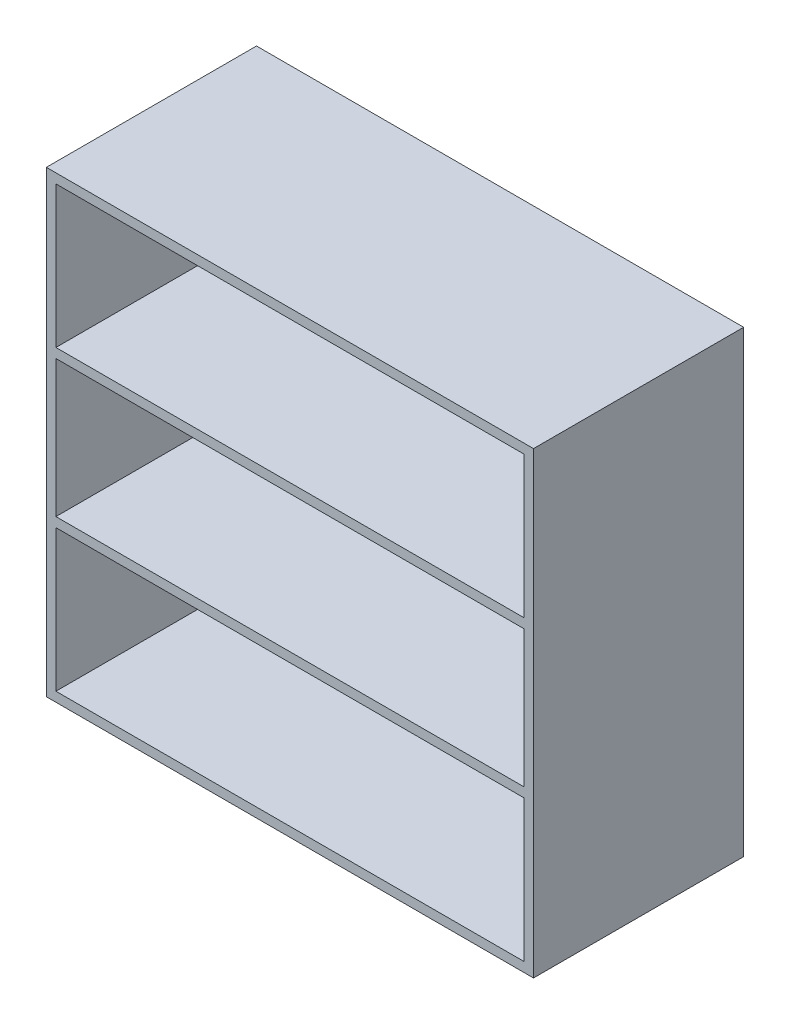
ISO-10303-21;
HEADER;
FILE_DESCRIPTION(('STEP AP214'),'2;1');
FILE_NAME('part.step','',(''),(''),'','','');
FILE_SCHEMA(('AUTOMOTIVE_DESIGN { 1 0 10303 214 1 1 1 1 }'));
ENDSEC;
DATA;
#1=APPLICATION_CONTEXT('core data for automotive mechanical design processes');
#2=APPLICATION_PROTOCOL_DEFINITION('international standard','automotive_design',2000,#1);
#3=PRODUCT_CONTEXT('',#1,'mechanical');
#4=PRODUCT('Part','Part','',(#3));
#5=PRODUCT_RELATED_PRODUCT_CATEGORY('part','',(#4));
#6=PRODUCT_DEFINITION_FORMATION('','',#4);
#7=PRODUCT_DEFINITION_CONTEXT('part definition',#1,'design');
#8=PRODUCT_DEFINITION('design','',#6,#7);
#9=PRODUCT_DEFINITION_SHAPE('','',#8);
#10=(LENGTH_UNIT() NAMED_UNIT(*) SI_UNIT(.MILLI.,.METRE.));
#11=(NAMED_UNIT(*) PLANE_ANGLE_UNIT() SI_UNIT($,.RADIAN.));
#12=(NAMED_UNIT(*) SI_UNIT($,.STERADIAN.) SOLID_ANGLE_UNIT());
#13=UNCERTAINTY_MEASURE_WITH_UNIT(LENGTH_MEASURE(1.E-05),#10,'distance_accuracy_value','');
#14=(GEOMETRIC_REPRESENTATION_CONTEXT(3) GLOBAL_UNCERTAINTY_ASSIGNED_CONTEXT((#13)) GLOBAL_UNIT_ASSIGNED_CONTEXT((#10,
#11,#12)) REPRESENTATION_CONTEXT('',''));
#15=CARTESIAN_POINT('',(0.,0.,0.));
#16=DIRECTION('',(0.,0.,1.));
#17=DIRECTION('',(1.,0.,0.));
#18=AXIS2_PLACEMENT_3D('',#15,#16,#17);
#19=CARTESIAN_POINT('',(1295.4,2438.4,-558.8));
#20=DIRECTION('',(-1.,0.,0.));
#21=DIRECTION('',(0.,0.,1.));
#22=AXIS2_PLACEMENT_3D('',#19,#20,#21);
#23=PLANE('',#22);
#24=DIRECTION('',(0.,0.,-1.));
#25=VECTOR('',#24,1.);
#26=CARTESIAN_POINT('',(1295.4,0.,-558.8));
#27=LINE('',#26,#25);
#28=CARTESIAN_POINT('',(1295.4,0.,558.8));
#29=VERTEX_POINT('',#28);
#30=CARTESIAN_POINT('',(1295.4,0.,-558.8));
#31=VERTEX_POINT('',#30);
#32=EDGE_CURVE('E200',#29,#31,#27,.T.);
#33=ORIENTED_EDGE('',*,*,#32,.T.);
#34=DIRECTION('',(0.,-1.,0.));
#35=VECTOR('',#34,1.);
#36=CARTESIAN_POINT('',(1295.4,2438.4,-558.8));
#37=LINE('',#36,#35);
#38=CARTESIAN_POINT('',(1295.4,2438.4,-558.8));
#39=VERTEX_POINT('',#38);
#40=EDGE_CURVE('E11',#39,#31,#37,.T.);
#41=ORIENTED_EDGE('',*,*,#40,.F.);
#42=DIRECTION('',(0.,0.,-1.));
#43=VECTOR('',#42,1.);
#44=CARTESIAN_POINT('',(1295.4,2438.4,-558.8));
#45=LINE('',#44,#43);
#46=CARTESIAN_POINT('',(1295.4,2438.4,558.8));
#47=VERTEX_POINT('',#46);
#48=EDGE_CURVE('E291',#47,#39,#45,.T.);
#49=ORIENTED_EDGE('',*,*,#48,.F.);
#50=DIRECTION('',(0.,-1.,0.));
#51=VECTOR('',#50,1.);
#52=CARTESIAN_POINT('',(1295.4,2438.4,558.8));
#53=LINE('',#52,#51);
#54=EDGE_CURVE('E305',#47,#29,#53,.T.);
#55=ORIENTED_EDGE('',*,*,#54,.T.);
#56=EDGE_LOOP('',(#33,#41,#49,#55));
#57=FACE_BOUND('',#56,.T.);
#58=ADVANCED_FACE('F39',(#57),#23,.F.);
#59=CARTESIAN_POINT('',(-1295.4,2438.4,-558.8));
#60=DIRECTION('',(0.,0.,1.));
#61=DIRECTION('',(1.,0.,0.));
#62=AXIS2_PLACEMENT_3D('',#59,#60,#61);
#63=PLANE('',#62);
#64=DIRECTION('',(-1.,0.,0.));
#65=VECTOR('',#64,1.);
#66=CARTESIAN_POINT('',(-1244.6,804.333333333333,-558.8));
#67=LINE('',#66,#65);
#68=CARTESIAN_POINT('',(1244.6,804.333333333333,-558.8));
#69=VERTEX_POINT('',#68);
#70=CARTESIAN_POINT('',(-1244.6,804.333333333333,-558.8));
#71=VERTEX_POINT('',#70);
#72=EDGE_CURVE('E165',#69,#71,#67,.T.);
#73=ORIENTED_EDGE('',*,*,#72,.T.);
#74=DIRECTION('',(0.,-1.,0.));
#75=VECTOR('',#74,1.);
#76=CARTESIAN_POINT('',(-1244.6,804.333333333333,-558.8));
#77=LINE('',#76,#75);
#78=CARTESIAN_POINT('',(-1244.6,50.8,-558.8));
#79=VERTEX_POINT('',#78);
#80=EDGE_CURVE('E156',#71,#79,#77,.T.);
#81=ORIENTED_EDGE('',*,*,#80,.T.);
#82=DIRECTION('',(1.,0.,0.));
#83=VECTOR('',#82,1.);
#84=CARTESIAN_POINT('',(-1244.6,50.8,-558.8));
#85=LINE('',#84,#83);
#86=CARTESIAN_POINT('',(1244.6,50.8000000000003,-558.8));
#87=VERTEX_POINT('',#86);
#88=EDGE_CURVE('E168',#79,#87,#85,.T.);
#89=ORIENTED_EDGE('',*,*,#88,.T.);
#90=DIRECTION('',(0.,1.,0.));
#91=VECTOR('',#90,1.);
#92=CARTESIAN_POINT('',(1244.6,50.8000000000002,-558.8));
#93=LINE('',#92,#91);
#94=EDGE_CURVE('E54',#87,#69,#93,.T.);
#95=ORIENTED_EDGE('',*,*,#94,.T.);
#96=EDGE_LOOP('',(#73,#81,#89,#95));
#97=FACE_BOUND('',#96,.T.);
#98=DIRECTION('',(1.,0.,0.));
#99=VECTOR('',#98,1.);
#100=CARTESIAN_POINT('',(-1244.6,1634.06666666667,-558.8));
#101=LINE('',#100,#99);
#102=CARTESIAN_POINT('',(-1244.6,1634.06666666667,-558.8));
#103=VERTEX_POINT('',#102);
#104=CARTESIAN_POINT('',(1244.6,1634.06666666667,-558.8));
#105=VERTEX_POINT('',#104);
#106=EDGE_CURVE('E217',#103,#105,#101,.T.);
#107=ORIENTED_EDGE('',*,*,#106,.T.);
#108=DIRECTION('',(0.,1.,0.));
#109=VECTOR('',#108,1.);
#110=CARTESIAN_POINT('',(1244.6,1634.06666666667,-558.8));
#111=LINE('',#110,#109);
#112=CARTESIAN_POINT('',(1244.6,2387.6,-558.8));
#113=VERTEX_POINT('',#112);
#114=EDGE_CURVE('E206',#105,#113,#111,.T.);
#115=ORIENTED_EDGE('',*,*,#114,.T.);
#116=DIRECTION('',(-1.,0.,0.));
#117=VECTOR('',#116,1.);
#118=CARTESIAN_POINT('',(1244.6,2387.6,-558.8));
#119=LINE('',#118,#117);
#120=CARTESIAN_POINT('',(-1244.6,2387.6,-558.8));
#121=VERTEX_POINT('',#120);
#122=EDGE_CURVE('E210',#113,#121,#119,.T.);
#123=ORIENTED_EDGE('',*,*,#122,.T.);
#124=DIRECTION('',(0.,-1.,0.));
#125=VECTOR('',#124,1.);
#126=CARTESIAN_POINT('',(-1244.6,2387.6,-558.8));
#127=LINE('',#126,#125);
#128=EDGE_CURVE('E62',#121,#103,#127,.T.);
#129=ORIENTED_EDGE('',*,*,#128,.T.);
#130=EDGE_LOOP('',(#107,#115,#123,#129));
#131=FACE_BOUND('',#130,.T.);
#132=DIRECTION('',(-1.,0.,0.));
#133=VECTOR('',#132,1.);
#134=CARTESIAN_POINT('',(-1244.6,1583.26666666667,-558.8));
#135=LINE('',#134,#133);
#136=CARTESIAN_POINT('',(1244.6,1583.26666666667,-558.8));
#137=VERTEX_POINT('',#136);
#138=CARTESIAN_POINT('',(-1244.6,1583.26666666667,-558.8));
#139=VERTEX_POINT('',#138);
#140=EDGE_CURVE('E261',#137,#139,#135,.T.);
#141=ORIENTED_EDGE('',*,*,#140,.T.);
#142=DIRECTION('',(0.,-1.,0.));
#143=VECTOR('',#142,1.);
#144=CARTESIAN_POINT('',(-1244.6,1583.26666666667,-558.8));
#145=LINE('',#144,#143);
#146=CARTESIAN_POINT('',(-1244.6,855.133333333333,-558.8));
#147=VERTEX_POINT('',#146);
#148=EDGE_CURVE('E248',#139,#147,#145,.T.);
#149=ORIENTED_EDGE('',*,*,#148,.T.);
#150=DIRECTION('',(1.,0.,0.));
#151=VECTOR('',#150,1.);
#152=CARTESIAN_POINT('',(-1244.6,855.133333333333,-558.8));
#153=LINE('',#152,#151);
#154=CARTESIAN_POINT('',(1244.6,855.133333333333,-558.8));
#155=VERTEX_POINT('',#154);
#156=EDGE_CURVE('E252',#147,#155,#153,.T.);
#157=ORIENTED_EDGE('',*,*,#156,.T.);
#158=DIRECTION('',(0.,1.,0.));
#159=VECTOR('',#158,1.);
#160=CARTESIAN_POINT('',(1244.6,855.133333333333,-558.8));
#161=LINE('',#160,#159);
#162=EDGE_CURVE('E257',#155,#137,#161,.T.);
#163=ORIENTED_EDGE('',*,*,#162,.T.);
#164=EDGE_LOOP('',(#141,#149,#157,#163));
#165=FACE_BOUND('',#164,.T.);
#166=DIRECTION('',(-1.,0.,0.));
#167=VECTOR('',#166,1.);
#168=CARTESIAN_POINT('',(-1295.4,0.,-558.8));
#169=LINE('',#168,#167);
#170=CARTESIAN_POINT('',(-1295.4,0.,-558.8));
#171=VERTEX_POINT('',#170);
#172=EDGE_CURVE('E309',#31,#171,#169,.T.);
#173=ORIENTED_EDGE('',*,*,#172,.T.);
#174=DIRECTION('',(0.,-1.,0.));
#175=VECTOR('',#174,1.);
#176=CARTESIAN_POINT('',(-1295.4,2438.4,-558.8));
#177=LINE('',#176,#175);
#178=CARTESIAN_POINT('',(-1295.4,2438.4,-558.8));
#179=VERTEX_POINT('',#178);
#180=EDGE_CURVE('E47',#179,#171,#177,.T.);
#181=ORIENTED_EDGE('',*,*,#180,.F.);
#182=DIRECTION('',(-1.,0.,0.));
#183=VECTOR('',#182,1.);
#184=CARTESIAN_POINT('',(-1295.4,2438.4,-558.8));
#185=LINE('',#184,#183);
#186=EDGE_CURVE('E295',#39,#179,#185,.T.);
#187=ORIENTED_EDGE('',*,*,#186,.F.);
#188=ORIENTED_EDGE('',*,*,#40,.T.);
#189=EDGE_LOOP('',(#173,#181,#187,#188));
#190=FACE_BOUND('',#189,.T.);
#191=ADVANCED_FACE('F173',(#97,#131,#165,#190),#63,.F.);
#192=CARTESIAN_POINT('',(-1295.4,2438.4,-558.8));
#193=DIRECTION('',(1.,0.,0.));
#194=DIRECTION('',(0.,0.,-1.));
#195=AXIS2_PLACEMENT_3D('',#192,#193,#194);
#196=PLANE('',#195);
#197=DIRECTION('',(0.,0.,1.));
#198=VECTOR('',#197,1.);
#199=CARTESIAN_POINT('',(-1295.4,0.,-558.8));
#200=LINE('',#199,#198);
#201=CARTESIAN_POINT('',(-1295.4,0.,558.8));
#202=VERTEX_POINT('',#201);
#203=EDGE_CURVE('E312',#171,#202,#200,.T.);
#204=ORIENTED_EDGE('',*,*,#203,.T.);
#205=DIRECTION('',(0.,-1.,0.));
#206=VECTOR('',#205,1.);
#207=CARTESIAN_POINT('',(-1295.4,2438.4,558.8));
#208=LINE('',#207,#206);
#209=CARTESIAN_POINT('',(-1295.4,2438.4,558.8));
#210=VERTEX_POINT('',#209);
#211=EDGE_CURVE('E320',#210,#202,#208,.T.);
#212=ORIENTED_EDGE('',*,*,#211,.F.);
#213=DIRECTION('',(0.,0.,1.));
#214=VECTOR('',#213,1.);
#215=CARTESIAN_POINT('',(-1295.4,2438.4,-558.8));
#216=LINE('',#215,#214);
#217=EDGE_CURVE('E299',#179,#210,#216,.T.);
#218=ORIENTED_EDGE('',*,*,#217,.F.);
#219=ORIENTED_EDGE('',*,*,#180,.T.);
#220=EDGE_LOOP('',(#204,#212,#218,#219));
#221=FACE_BOUND('',#220,.T.);
#222=ADVANCED_FACE('F329',(#221),#196,.F.);
#223=CARTESIAN_POINT('',(-1295.4,2438.4,558.8));
#224=DIRECTION('',(0.,0.,-1.));
#225=DIRECTION('',(-1.,0.,0.));
#226=AXIS2_PLACEMENT_3D('',#223,#224,#225);
#227=PLANE('',#226);
#228=DIRECTION('',(1.,0.,0.));
#229=VECTOR('',#228,1.);
#230=CARTESIAN_POINT('',(-1244.6,50.8,558.8));
#231=LINE('',#230,#229);
#232=CARTESIAN_POINT('',(-1244.6,50.8000000000002,558.8));
#233=VERTEX_POINT('',#232);
#234=CARTESIAN_POINT('',(1244.6,50.8000000000002,558.8));
#235=VERTEX_POINT('',#234);
#236=EDGE_CURVE('E190',#233,#235,#231,.T.);
#237=ORIENTED_EDGE('',*,*,#236,.F.);
#238=DIRECTION('',(0.,-1.,0.));
#239=VECTOR('',#238,1.);
#240=CARTESIAN_POINT('',(-1244.6,804.333333333333,558.8));
#241=LINE('',#240,#239);
#242=CARTESIAN_POINT('',(-1244.6,804.333333333333,558.8));
#243=VERTEX_POINT('',#242);
#244=EDGE_CURVE('E159',#243,#233,#241,.T.);
#245=ORIENTED_EDGE('',*,*,#244,.F.);
#246=DIRECTION('',(-1.,0.,0.));
#247=VECTOR('',#246,1.);
#248=CARTESIAN_POINT('',(-1244.6,804.333333333333,558.8));
#249=LINE('',#248,#247);
#250=CARTESIAN_POINT('',(1244.6,804.333333333333,558.8));
#251=VERTEX_POINT('',#250);
#252=EDGE_CURVE('E177',#251,#243,#249,.T.);
#253=ORIENTED_EDGE('',*,*,#252,.F.);
#254=DIRECTION('',(0.,1.,0.));
#255=VECTOR('',#254,1.);
#256=CARTESIAN_POINT('',(1244.6,50.8000000000002,558.8));
#257=LINE('',#256,#255);
#258=EDGE_CURVE('E181',#235,#251,#257,.T.);
#259=ORIENTED_EDGE('',*,*,#258,.F.);
#260=EDGE_LOOP('',(#237,#245,#253,#259));
#261=FACE_BOUND('',#260,.T.);
#262=DIRECTION('',(-1.,0.,0.));
#263=VECTOR('',#262,1.);
#264=CARTESIAN_POINT('',(1244.6,2387.6,558.8));
#265=LINE('',#264,#263);
#266=CARTESIAN_POINT('',(1244.6,2387.6,558.8));
#267=VERTEX_POINT('',#266);
#268=CARTESIAN_POINT('',(-1244.6,2387.6,558.8));
#269=VERTEX_POINT('',#268);
#270=EDGE_CURVE('E225',#267,#269,#265,.T.);
#271=ORIENTED_EDGE('',*,*,#270,.F.);
#272=DIRECTION('',(0.,1.,0.));
#273=VECTOR('',#272,1.);
#274=CARTESIAN_POINT('',(1244.6,1634.06666666667,558.8));
#275=LINE('',#274,#273);
#276=CARTESIAN_POINT('',(1244.6,1634.06666666667,558.8));
#277=VERTEX_POINT('',#276);
#278=EDGE_CURVE('E222',#277,#267,#275,.T.);
#279=ORIENTED_EDGE('',*,*,#278,.F.);
#280=DIRECTION('',(1.,0.,0.));
#281=VECTOR('',#280,1.);
#282=CARTESIAN_POINT('',(-1244.6,1634.06666666667,558.8));
#283=LINE('',#282,#281);
#284=CARTESIAN_POINT('',(-1244.6,1634.06666666667,558.8));
#285=VERTEX_POINT('',#284);
#286=EDGE_CURVE('E211',#285,#277,#283,.T.);
#287=ORIENTED_EDGE('',*,*,#286,.F.);
#288=DIRECTION('',(0.,-1.,0.));
#289=VECTOR('',#288,1.);
#290=CARTESIAN_POINT('',(-1244.6,2387.6,558.8));
#291=LINE('',#290,#289);
#292=EDGE_CURVE('E230',#269,#285,#291,.T.);
#293=ORIENTED_EDGE('',*,*,#292,.F.);
#294=EDGE_LOOP('',(#271,#279,#287,#293));
#295=FACE_BOUND('',#294,.T.);
#296=DIRECTION('',(1.,0.,0.));
#297=VECTOR('',#296,1.);
#298=CARTESIAN_POINT('',(-1244.6,855.133333333333,558.8));
#299=LINE('',#298,#297);
#300=CARTESIAN_POINT('',(-1244.6,855.133333333333,558.8));
#301=VERTEX_POINT('',#300);
#302=CARTESIAN_POINT('',(1244.6,855.133333333333,558.8));
#303=VERTEX_POINT('',#302);
#304=EDGE_CURVE('E269',#301,#303,#299,.T.);
#305=ORIENTED_EDGE('',*,*,#304,.F.);
#306=DIRECTION('',(0.,-1.,0.));
#307=VECTOR('',#306,1.);
#308=CARTESIAN_POINT('',(-1244.6,1583.26666666667,558.8));
#309=LINE('',#308,#307);
#310=CARTESIAN_POINT('',(-1244.6,1583.26666666667,558.8));
#311=VERTEX_POINT('',#310);
#312=EDGE_CURVE('E266',#311,#301,#309,.T.);
#313=ORIENTED_EDGE('',*,*,#312,.F.);
#314=DIRECTION('',(-1.,0.,0.));
#315=VECTOR('',#314,1.);
#316=CARTESIAN_POINT('',(-1244.6,1583.26666666667,558.8));
#317=LINE('',#316,#315);
#318=CARTESIAN_POINT('',(1244.6,1583.26666666667,558.8));
#319=VERTEX_POINT('',#318);
#320=EDGE_CURVE('E253',#319,#311,#317,.T.);
#321=ORIENTED_EDGE('',*,*,#320,.F.);
#322=DIRECTION('',(0.,1.,0.));
#323=VECTOR('',#322,1.);
#324=CARTESIAN_POINT('',(1244.6,855.133333333333,558.8));
#325=LINE('',#324,#323);
#326=EDGE_CURVE('E273',#303,#319,#325,.T.);
#327=ORIENTED_EDGE('',*,*,#326,.F.);
#328=EDGE_LOOP('',(#305,#313,#321,#327));
#329=FACE_BOUND('',#328,.T.);
#330=DIRECTION('',(1.,0.,0.));
#331=VECTOR('',#330,1.);
#332=CARTESIAN_POINT('',(-1295.4,0.,558.8));
#333=LINE('',#332,#331);
#334=EDGE_CURVE('E296',#202,#29,#333,.T.);
#335=ORIENTED_EDGE('',*,*,#334,.T.);
#336=ORIENTED_EDGE('',*,*,#54,.F.);
#337=DIRECTION('',(1.,0.,0.));
#338=VECTOR('',#337,1.);
#339=CARTESIAN_POINT('',(-1295.4,2438.4,558.8));
#340=LINE('',#339,#338);
#341=EDGE_CURVE('E302',#210,#47,#340,.T.);
#342=ORIENTED_EDGE('',*,*,#341,.F.);
#343=ORIENTED_EDGE('',*,*,#211,.T.);
#344=EDGE_LOOP('',(#335,#336,#342,#343));
#345=FACE_BOUND('',#344,.T.);
#346=ADVANCED_FACE('F338',(#261,#295,#329,#345),#227,.F.);
#347=CARTESIAN_POINT('',(0.,2438.4,0.));
#348=DIRECTION('',(0.,1.,0.));
#349=DIRECTION('',(0.,0.,1.));
#350=AXIS2_PLACEMENT_3D('',#347,#348,#349);
#351=PLANE('',#350);
#352=ORIENTED_EDGE('',*,*,#48,.T.);
#353=ORIENTED_EDGE('',*,*,#186,.T.);
#354=ORIENTED_EDGE('',*,*,#217,.T.);
#355=ORIENTED_EDGE('',*,*,#341,.T.);
#356=EDGE_LOOP('',(#352,#353,#354,#355));
#357=FACE_BOUND('',#356,.T.);
#358=ADVANCED_FACE('F344',(#357),#351,.T.);
#359=CARTESIAN_POINT('',(0.,0.,0.));
#360=DIRECTION('',(0.,1.,0.));
#361=DIRECTION('',(0.,0.,1.));
#362=AXIS2_PLACEMENT_3D('',#359,#360,#361);
#363=PLANE('',#362);
#364=ORIENTED_EDGE('',*,*,#32,.F.);
#365=ORIENTED_EDGE('',*,*,#334,.F.);
#366=ORIENTED_EDGE('',*,*,#203,.F.);
#367=ORIENTED_EDGE('',*,*,#172,.F.);
#368=EDGE_LOOP('',(#364,#365,#366,#367));
#369=FACE_BOUND('',#368,.T.);
#370=ADVANCED_FACE('F335',(#369),#363,.F.);
#371=CARTESIAN_POINT('',(-1244.6,1583.26666666667,-558.8));
#372=DIRECTION('',(-1.,0.,0.));
#373=DIRECTION('',(0.,0.,1.));
#374=AXIS2_PLACEMENT_3D('',#371,#372,#373);
#375=PLANE('',#374);
#376=ORIENTED_EDGE('',*,*,#312,.T.);
#377=DIRECTION('',(0.,0.,1.));
#378=VECTOR('',#377,1.);
#379=CARTESIAN_POINT('',(-1244.6,855.133333333333,-558.8));
#380=LINE('',#379,#378);
#381=EDGE_CURVE('E265',#147,#301,#380,.T.);
#382=ORIENTED_EDGE('',*,*,#381,.F.);
#383=ORIENTED_EDGE('',*,*,#148,.F.);
#384=DIRECTION('',(0.,0.,1.));
#385=VECTOR('',#384,1.);
#386=CARTESIAN_POINT('',(-1244.6,1583.26666666667,-558.8));
#387=LINE('',#386,#385);
#388=EDGE_CURVE('E226',#139,#311,#387,.T.);
#389=ORIENTED_EDGE('',*,*,#388,.T.);
#390=EDGE_LOOP('',(#376,#382,#383,#389));
#391=FACE_BOUND('',#390,.T.);
#392=ADVANCED_FACE('F357',(#391),#375,.F.);
#393=CARTESIAN_POINT('',(-1244.6,1583.26666666667,-558.8));
#394=DIRECTION('',(0.,1.,0.));
#395=DIRECTION('',(0.,0.,1.));
#396=AXIS2_PLACEMENT_3D('',#393,#394,#395);
#397=PLANE('',#396);
#398=ORIENTED_EDGE('',*,*,#320,.T.);
#399=ORIENTED_EDGE('',*,*,#388,.F.);
#400=ORIENTED_EDGE('',*,*,#140,.F.);
#401=DIRECTION('',(0.,0.,1.));
#402=VECTOR('',#401,1.);
#403=CARTESIAN_POINT('',(1244.6,1583.26666666667,-558.8));
#404=LINE('',#403,#402);
#405=EDGE_CURVE('E282',#137,#319,#404,.T.);
#406=ORIENTED_EDGE('',*,*,#405,.T.);
#407=EDGE_LOOP('',(#398,#399,#400,#406));
#408=FACE_BOUND('',#407,.T.);
#409=ADVANCED_FACE('F362',(#408),#397,.F.);
#410=CARTESIAN_POINT('',(1244.6,855.133333333333,-558.8));
#411=DIRECTION('',(1.,0.,0.));
#412=DIRECTION('',(0.,1.,0.));
#413=AXIS2_PLACEMENT_3D('',#410,#411,#412);
#414=PLANE('',#413);
#415=ORIENTED_EDGE('',*,*,#326,.T.);
#416=ORIENTED_EDGE('',*,*,#405,.F.);
#417=ORIENTED_EDGE('',*,*,#162,.F.);
#418=DIRECTION('',(0.,0.,1.));
#419=VECTOR('',#418,1.);
#420=CARTESIAN_POINT('',(1244.6,855.133333333333,-558.8));
#421=LINE('',#420,#419);
#422=EDGE_CURVE('E285',#155,#303,#421,.T.);
#423=ORIENTED_EDGE('',*,*,#422,.T.);
#424=EDGE_LOOP('',(#415,#416,#417,#423));
#425=FACE_BOUND('',#424,.T.);
#426=ADVANCED_FACE('F368',(#425),#414,.F.);
#427=CARTESIAN_POINT('',(-1244.6,855.133333333333,-558.8));
#428=DIRECTION('',(0.,-1.,0.));
#429=DIRECTION('',(0.,0.,-1.));
#430=AXIS2_PLACEMENT_3D('',#427,#428,#429);
#431=PLANE('',#430);
#432=ORIENTED_EDGE('',*,*,#304,.T.);
#433=ORIENTED_EDGE('',*,*,#422,.F.);
#434=ORIENTED_EDGE('',*,*,#156,.F.);
#435=ORIENTED_EDGE('',*,*,#381,.T.);
#436=EDGE_LOOP('',(#432,#433,#434,#435));
#437=FACE_BOUND('',#436,.T.);
#438=ADVANCED_FACE('F364',(#437),#431,.F.);
#439=CARTESIAN_POINT('',(1244.6,1634.06666666667,-558.8));
#440=DIRECTION('',(1.,0.,0.));
#441=DIRECTION('',(0.,1.,0.));
#442=AXIS2_PLACEMENT_3D('',#439,#440,#441);
#443=PLANE('',#442);
#444=ORIENTED_EDGE('',*,*,#278,.T.);
#445=DIRECTION('',(0.,0.,1.));
#446=VECTOR('',#445,1.);
#447=CARTESIAN_POINT('',(1244.6,2387.6,-558.8));
#448=LINE('',#447,#446);
#449=EDGE_CURVE('E221',#113,#267,#448,.T.);
#450=ORIENTED_EDGE('',*,*,#449,.F.);
#451=ORIENTED_EDGE('',*,*,#114,.F.);
#452=DIRECTION('',(0.,0.,1.));
#453=VECTOR('',#452,1.);
#454=CARTESIAN_POINT('',(1244.6,1634.06666666667,-558.8));
#455=LINE('',#454,#453);
#456=EDGE_CURVE('E191',#105,#277,#455,.T.);
#457=ORIENTED_EDGE('',*,*,#456,.T.);
#458=EDGE_LOOP('',(#444,#450,#451,#457));
#459=FACE_BOUND('',#458,.T.);
#460=ADVANCED_FACE('F367',(#459),#443,.F.);
#461=CARTESIAN_POINT('',(-1244.6,1634.06666666667,-558.8));
#462=DIRECTION('',(0.,-1.,0.));
#463=DIRECTION('',(0.,0.,-1.));
#464=AXIS2_PLACEMENT_3D('',#461,#462,#463);
#465=PLANE('',#464);
#466=ORIENTED_EDGE('',*,*,#286,.T.);
#467=ORIENTED_EDGE('',*,*,#456,.F.);
#468=ORIENTED_EDGE('',*,*,#106,.F.);
#469=DIRECTION('',(0.,0.,1.));
#470=VECTOR('',#469,1.);
#471=CARTESIAN_POINT('',(-1244.6,1634.06666666667,-558.8));
#472=LINE('',#471,#470);
#473=EDGE_CURVE('E239',#103,#285,#472,.T.);
#474=ORIENTED_EDGE('',*,*,#473,.T.);
#475=EDGE_LOOP('',(#466,#467,#468,#474));
#476=FACE_BOUND('',#475,.T.);
#477=ADVANCED_FACE('F378',(#476),#465,.F.);
#478=CARTESIAN_POINT('',(-1244.6,2387.6,-558.8));
#479=DIRECTION('',(-1.,0.,0.));
#480=DIRECTION('',(0.,-1.,0.));
#481=AXIS2_PLACEMENT_3D('',#478,#479,#480);
#482=PLANE('',#481);
#483=ORIENTED_EDGE('',*,*,#292,.T.);
#484=ORIENTED_EDGE('',*,*,#473,.F.);
#485=ORIENTED_EDGE('',*,*,#128,.F.);
#486=DIRECTION('',(0.,0.,1.));
#487=VECTOR('',#486,1.);
#488=CARTESIAN_POINT('',(-1244.6,2387.6,-558.8));
#489=LINE('',#488,#487);
#490=EDGE_CURVE('E242',#121,#269,#489,.T.);
#491=ORIENTED_EDGE('',*,*,#490,.T.);
#492=EDGE_LOOP('',(#483,#484,#485,#491));
#493=FACE_BOUND('',#492,.T.);
#494=ADVANCED_FACE('F383',(#493),#482,.F.);
#495=CARTESIAN_POINT('',(1244.6,2387.6,-558.8));
#496=DIRECTION('',(0.,1.,0.));
#497=DIRECTION('',(-1.,0.,0.));
#498=AXIS2_PLACEMENT_3D('',#495,#496,#497);
#499=PLANE('',#498);
#500=ORIENTED_EDGE('',*,*,#270,.T.);
#501=ORIENTED_EDGE('',*,*,#490,.F.);
#502=ORIENTED_EDGE('',*,*,#122,.F.);
#503=ORIENTED_EDGE('',*,*,#449,.T.);
#504=EDGE_LOOP('',(#500,#501,#502,#503));
#505=FACE_BOUND('',#504,.T.);
#506=ADVANCED_FACE('F380',(#505),#499,.F.);
#507=CARTESIAN_POINT('',(-1244.6,804.333333333333,-558.8));
#508=DIRECTION('',(-1.,0.,0.));
#509=DIRECTION('',(0.,0.,1.));
#510=AXIS2_PLACEMENT_3D('',#507,#508,#509);
#511=PLANE('',#510);
#512=ORIENTED_EDGE('',*,*,#244,.T.);
#513=DIRECTION('',(0.,0.,1.));
#514=VECTOR('',#513,1.);
#515=CARTESIAN_POINT('',(-1244.6,50.8,-558.8));
#516=LINE('',#515,#514);
#517=EDGE_CURVE('E152',#79,#233,#516,.T.);
#518=ORIENTED_EDGE('',*,*,#517,.F.);
#519=ORIENTED_EDGE('',*,*,#80,.F.);
#520=DIRECTION('',(0.,0.,1.));
#521=VECTOR('',#520,1.);
#522=CARTESIAN_POINT('',(-1244.6,804.333333333333,-558.8));
#523=LINE('',#522,#521);
#524=EDGE_CURVE('E197',#71,#243,#523,.T.);
#525=ORIENTED_EDGE('',*,*,#524,.T.);
#526=EDGE_LOOP('',(#512,#518,#519,#525));
#527=FACE_BOUND('',#526,.T.);
#528=ADVANCED_FACE('F154',(#527),#511,.F.);
#529=CARTESIAN_POINT('',(-1244.6,804.333333333333,-558.8));
#530=DIRECTION('',(0.,1.,0.));
#531=DIRECTION('',(0.,0.,1.));
#532=AXIS2_PLACEMENT_3D('',#529,#530,#531);
#533=PLANE('',#532);
#534=ORIENTED_EDGE('',*,*,#252,.T.);
#535=ORIENTED_EDGE('',*,*,#524,.F.);
#536=ORIENTED_EDGE('',*,*,#72,.F.);
#537=DIRECTION('',(0.,0.,1.));
#538=VECTOR('',#537,1.);
#539=CARTESIAN_POINT('',(1244.6,804.333333333333,-558.8));
#540=LINE('',#539,#538);
#541=EDGE_CURVE('E201',#69,#251,#540,.T.);
#542=ORIENTED_EDGE('',*,*,#541,.T.);
#543=EDGE_LOOP('',(#534,#535,#536,#542));
#544=FACE_BOUND('',#543,.T.);
#545=ADVANCED_FACE('F392',(#544),#533,.F.);
#546=CARTESIAN_POINT('',(1244.6,50.8000000000002,-558.8));
#547=DIRECTION('',(1.,0.,0.));
#548=DIRECTION('',(0.,0.,-1.));
#549=AXIS2_PLACEMENT_3D('',#546,#547,#548);
#550=PLANE('',#549);
#551=ORIENTED_EDGE('',*,*,#258,.T.);
#552=ORIENTED_EDGE('',*,*,#541,.F.);
#553=ORIENTED_EDGE('',*,*,#94,.F.);
#554=DIRECTION('',(0.,0.,1.));
#555=VECTOR('',#554,1.);
#556=CARTESIAN_POINT('',(1244.6,50.8000000000002,-558.8));
#557=LINE('',#556,#555);
#558=EDGE_CURVE('E164',#87,#235,#557,.T.);
#559=ORIENTED_EDGE('',*,*,#558,.T.);
#560=EDGE_LOOP('',(#551,#552,#553,#559));
#561=FACE_BOUND('',#560,.T.);
#562=ADVANCED_FACE('F395',(#561),#550,.F.);
#563=CARTESIAN_POINT('',(-1244.6,50.8,-558.8));
#564=DIRECTION('',(0.,-1.,0.));
#565=DIRECTION('',(1.,0.,0.));
#566=AXIS2_PLACEMENT_3D('',#563,#564,#565);
#567=PLANE('',#566);
#568=ORIENTED_EDGE('',*,*,#236,.T.);
#569=ORIENTED_EDGE('',*,*,#558,.F.);
#570=ORIENTED_EDGE('',*,*,#88,.F.);
#571=ORIENTED_EDGE('',*,*,#517,.T.);
#572=EDGE_LOOP('',(#568,#569,#570,#571));
#573=FACE_BOUND('',#572,.T.);
#574=ADVANCED_FACE('F169',(#573),#567,.F.);
#575=CLOSED_SHELL('',(#58,#191,#222,#346,#358,#370,#392,#409,#426,#438,#460,#477,#494,#506,#528,
#545,#562,#574));
#576=MANIFOLD_SOLID_BREP('B2',#575);
#577=ADVANCED_BREP_SHAPE_REPRESENTATION('',(#18,#576),#14);
#578=SHAPE_DEFINITION_REPRESENTATION(#9,#577);
ENDSEC;
END-ISO-10303-21;
